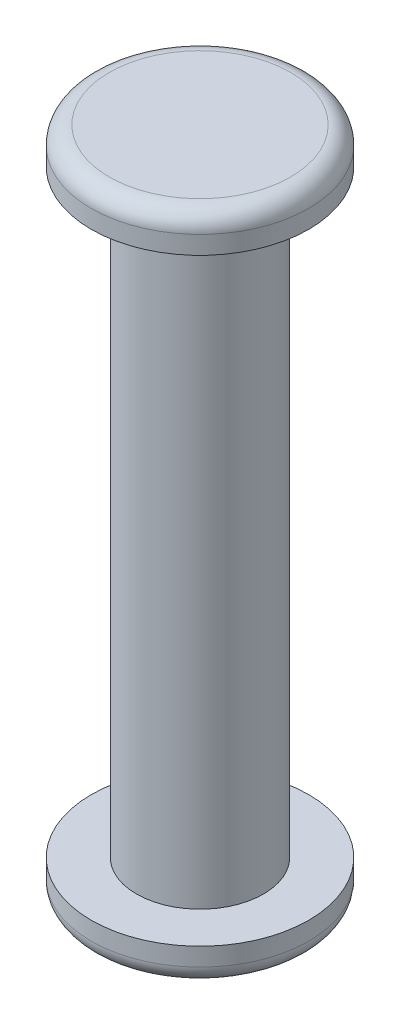
ISO-10303-21;
HEADER;
FILE_DESCRIPTION(('STEP AP214'),'2;1');
FILE_NAME('part.step','',(''),(''),'','','');
FILE_SCHEMA(('AUTOMOTIVE_DESIGN { 1 0 10303 214 1 1 1 1 }'));
ENDSEC;
DATA;
#1=APPLICATION_CONTEXT('core data for automotive mechanical design processes');
#2=APPLICATION_PROTOCOL_DEFINITION('international standard','automotive_design',2000,#1);
#3=PRODUCT_CONTEXT('',#1,'mechanical');
#4=PRODUCT('Part','Part','',(#3));
#5=PRODUCT_RELATED_PRODUCT_CATEGORY('part','',(#4));
#6=PRODUCT_DEFINITION_FORMATION('','',#4);
#7=PRODUCT_DEFINITION_CONTEXT('part definition',#1,'design');
#8=PRODUCT_DEFINITION('design','',#6,#7);
#9=PRODUCT_DEFINITION_SHAPE('','',#8);
#10=(LENGTH_UNIT() NAMED_UNIT(*) SI_UNIT(.MILLI.,.METRE.));
#11=(NAMED_UNIT(*) PLANE_ANGLE_UNIT() SI_UNIT($,.RADIAN.));
#12=(NAMED_UNIT(*) SI_UNIT($,.STERADIAN.) SOLID_ANGLE_UNIT());
#13=UNCERTAINTY_MEASURE_WITH_UNIT(LENGTH_MEASURE(1.E-05),#10,'distance_accuracy_value','');
#14=(GEOMETRIC_REPRESENTATION_CONTEXT(3) GLOBAL_UNCERTAINTY_ASSIGNED_CONTEXT((#13)) GLOBAL_UNIT_ASSIGNED_CONTEXT((#10,
#11,#12)) REPRESENTATION_CONTEXT('',''));
#15=CARTESIAN_POINT('',(0.,0.,0.));
#16=DIRECTION('',(0.,0.,1.));
#17=DIRECTION('',(1.,0.,0.));
#18=AXIS2_PLACEMENT_3D('',#15,#16,#17);
#19=CARTESIAN_POINT('',(0.,16.5,0.));
#20=DIRECTION('',(0.,-1.,0.));
#21=DIRECTION('',(0.,0.,-1.));
#22=AXIS2_PLACEMENT_3D('',#19,#20,#21);
#23=CYLINDRICAL_SURFACE('',#22,1.75);
#24=CARTESIAN_POINT('',(0.,16.5,0.));
#25=DIRECTION('',(0.,1.,0.));
#26=DIRECTION('',(0.,0.,1.));
#27=AXIS2_PLACEMENT_3D('',#24,#25,#26);
#28=CIRCLE('',#27,1.75);
#29=CARTESIAN_POINT('',(0.,16.5,1.75));
#30=VERTEX_POINT('',#29);
#31=EDGE_CURVE('E61',#30,#30,#28,.T.);
#32=ORIENTED_EDGE('',*,*,#31,.F.);
#33=EDGE_LOOP('',(#32));
#34=FACE_BOUND('',#33,.T.);
#35=CARTESIAN_POINT('',(0.,0.,0.));
#36=DIRECTION('',(0.,1.,0.));
#37=DIRECTION('',(0.,0.,1.));
#38=AXIS2_PLACEMENT_3D('',#35,#36,#37);
#39=CIRCLE('',#38,1.75);
#40=CARTESIAN_POINT('',(0.,0.,1.75));
#41=VERTEX_POINT('',#40);
#42=EDGE_CURVE('E62',#41,#41,#39,.T.);
#43=ORIENTED_EDGE('',*,*,#42,.T.);
#44=EDGE_LOOP('',(#43));
#45=FACE_BOUND('',#44,.T.);
#46=ADVANCED_FACE('F41',(#34,#45),#23,.T.);
#47=CARTESIAN_POINT('',(0.,0.,0.));
#48=DIRECTION('',(0.,-1.,0.));
#49=DIRECTION('',(0.,0.,-1.));
#50=AXIS2_PLACEMENT_3D('',#47,#48,#49);
#51=PLANE('',#50);
#52=ORIENTED_EDGE('',*,*,#42,.F.);
#53=EDGE_LOOP('',(#52));
#54=FACE_BOUND('',#53,.T.);
#55=CARTESIAN_POINT('',(0.,0.,0.));
#56=DIRECTION('',(0.,-1.,0.));
#57=DIRECTION('',(0.,0.,-1.));
#58=AXIS2_PLACEMENT_3D('',#55,#56,#57);
#59=CIRCLE('',#58,3.);
#60=CARTESIAN_POINT('',(0.,0.,-3.));
#61=VERTEX_POINT('',#60);
#62=EDGE_CURVE('E65',#61,#61,#59,.T.);
#63=ORIENTED_EDGE('',*,*,#62,.F.);
#64=EDGE_LOOP('',(#63));
#65=FACE_BOUND('',#64,.T.);
#66=ADVANCED_FACE('F91',(#54,#65),#51,.F.);
#67=CARTESIAN_POINT('',(0.,0.,0.));
#68=DIRECTION('',(0.,-1.,0.));
#69=DIRECTION('',(0.,0.,-1.));
#70=AXIS2_PLACEMENT_3D('',#67,#68,#69);
#71=CYLINDRICAL_SURFACE('',#70,3.);
#72=CARTESIAN_POINT('',(0.,-0.500000000000001,0.));
#73=DIRECTION('',(0.,1.,0.));
#74=DIRECTION('',(0.,0.,1.));
#75=AXIS2_PLACEMENT_3D('',#72,#73,#74);
#76=CIRCLE('',#75,3.);
#77=CARTESIAN_POINT('',(0.,-0.500000000000001,3.));
#78=VERTEX_POINT('',#77);
#79=EDGE_CURVE('E52',#78,#78,#76,.T.);
#80=ORIENTED_EDGE('',*,*,#79,.T.);
#81=EDGE_LOOP('',(#80));
#82=FACE_BOUND('',#81,.T.);
#83=ORIENTED_EDGE('',*,*,#62,.T.);
#84=EDGE_LOOP('',(#83));
#85=FACE_BOUND('',#84,.T.);
#86=ADVANCED_FACE('F97',(#82,#85),#71,.T.);
#87=CARTESIAN_POINT('',(-3.,-1.,0.));
#88=DIRECTION('',(0.,1.,0.));
#89=DIRECTION('',(0.,0.,1.));
#90=AXIS2_PLACEMENT_3D('',#87,#88,#89);
#91=PLANE('',#90);
#92=CARTESIAN_POINT('',(0.,-1.,0.));
#93=DIRECTION('',(0.,1.,0.));
#94=DIRECTION('',(0.,0.,1.));
#95=AXIS2_PLACEMENT_3D('',#92,#93,#94);
#96=CIRCLE('',#95,2.5);
#97=CARTESIAN_POINT('',(0.,-1.,2.5));
#98=VERTEX_POINT('',#97);
#99=EDGE_CURVE('E56',#98,#98,#96,.F.);
#100=ORIENTED_EDGE('',*,*,#99,.T.);
#101=EDGE_LOOP('',(#100));
#102=FACE_BOUND('',#101,.T.);
#103=ADVANCED_FACE('F87',(#102),#91,.F.);
#104=CARTESIAN_POINT('',(0.,16.5,0.));
#105=DIRECTION('',(0.,1.,0.));
#106=DIRECTION('',(0.,0.,1.));
#107=AXIS2_PLACEMENT_3D('',#104,#105,#106);
#108=PLANE('',#107);
#109=ORIENTED_EDGE('',*,*,#31,.T.);
#110=EDGE_LOOP('',(#109));
#111=FACE_BOUND('',#110,.T.);
#112=CARTESIAN_POINT('',(0.,16.5,0.));
#113=DIRECTION('',(0.,-1.,0.));
#114=DIRECTION('',(0.,0.,-1.));
#115=AXIS2_PLACEMENT_3D('',#112,#113,#114);
#116=CIRCLE('',#115,3.);
#117=CARTESIAN_POINT('',(0.,16.5,-3.));
#118=VERTEX_POINT('',#117);
#119=EDGE_CURVE('E70',#118,#118,#116,.T.);
#120=ORIENTED_EDGE('',*,*,#119,.T.);
#121=EDGE_LOOP('',(#120));
#122=FACE_BOUND('',#121,.T.);
#123=ADVANCED_FACE('F74',(#111,#122),#108,.F.);
#124=CARTESIAN_POINT('',(0.,0.,0.));
#125=DIRECTION('',(0.,-1.,0.));
#126=DIRECTION('',(0.,0.,-1.));
#127=AXIS2_PLACEMENT_3D('',#124,#125,#126);
#128=CYLINDRICAL_SURFACE('',#127,3.);
#129=CARTESIAN_POINT('',(0.,17.,0.));
#130=DIRECTION('',(0.,-1.,0.));
#131=DIRECTION('',(0.,0.,-1.));
#132=AXIS2_PLACEMENT_3D('',#129,#130,#131);
#133=CIRCLE('',#132,3.);
#134=CARTESIAN_POINT('',(0.,17.,-3.));
#135=VERTEX_POINT('',#134);
#136=EDGE_CURVE('E48',#135,#135,#133,.T.);
#137=ORIENTED_EDGE('',*,*,#136,.T.);
#138=EDGE_LOOP('',(#137));
#139=FACE_BOUND('',#138,.T.);
#140=ORIENTED_EDGE('',*,*,#119,.F.);
#141=EDGE_LOOP('',(#140));
#142=FACE_BOUND('',#141,.T.);
#143=ADVANCED_FACE('F76',(#139,#142),#128,.T.);
#144=CARTESIAN_POINT('',(-3.,17.5,0.));
#145=DIRECTION('',(0.,-1.,0.));
#146=DIRECTION('',(0.,0.,-1.));
#147=AXIS2_PLACEMENT_3D('',#144,#145,#146);
#148=PLANE('',#147);
#149=CARTESIAN_POINT('',(0.,17.5,0.));
#150=DIRECTION('',(0.,-1.,0.));
#151=DIRECTION('',(0.,0.,-1.));
#152=AXIS2_PLACEMENT_3D('',#149,#150,#151);
#153=CIRCLE('',#152,2.5);
#154=CARTESIAN_POINT('',(0.,17.5,-2.5));
#155=VERTEX_POINT('',#154);
#156=EDGE_CURVE('E10',#155,#155,#153,.F.);
#157=ORIENTED_EDGE('',*,*,#156,.T.);
#158=EDGE_LOOP('',(#157));
#159=FACE_BOUND('',#158,.T.);
#160=ADVANCED_FACE('F78',(#159),#148,.F.);
#161=CARTESIAN_POINT('',(0.,-0.500000000000001,0.));
#162=DIRECTION('',(0.,1.,0.));
#163=DIRECTION('',(0.,0.,1.));
#164=AXIS2_PLACEMENT_3D('',#161,#162,#163);
#165=TOROIDAL_SURFACE('',#164,2.5,0.5);
#166=ORIENTED_EDGE('',*,*,#79,.F.);
#167=EDGE_LOOP('',(#166));
#168=FACE_BOUND('',#167,.T.);
#169=ORIENTED_EDGE('',*,*,#99,.F.);
#170=EDGE_LOOP('',(#169));
#171=FACE_BOUND('',#170,.T.);
#172=ADVANCED_FACE('F84',(#168,#171),#165,.T.);
#173=CARTESIAN_POINT('',(0.,17.,0.));
#174=DIRECTION('',(0.,-1.,0.));
#175=DIRECTION('',(0.,0.,-1.));
#176=AXIS2_PLACEMENT_3D('',#173,#174,#175);
#177=TOROIDAL_SURFACE('',#176,2.5,0.5);
#178=ORIENTED_EDGE('',*,*,#156,.F.);
#179=EDGE_LOOP('',(#178));
#180=FACE_BOUND('',#179,.T.);
#181=ORIENTED_EDGE('',*,*,#136,.F.);
#182=EDGE_LOOP('',(#181));
#183=FACE_BOUND('',#182,.T.);
#184=ADVANCED_FACE('F43',(#180,#183),#177,.T.);
#185=CLOSED_SHELL('',(#46,#66,#86,#103,#123,#143,#160,#172,#184));
#186=MANIFOLD_SOLID_BREP('B2',#185);
#187=ADVANCED_BREP_SHAPE_REPRESENTATION('',(#18,#186),#14);
#188=SHAPE_DEFINITION_REPRESENTATION(#9,#187);
ENDSEC;
END-ISO-10303-21;
